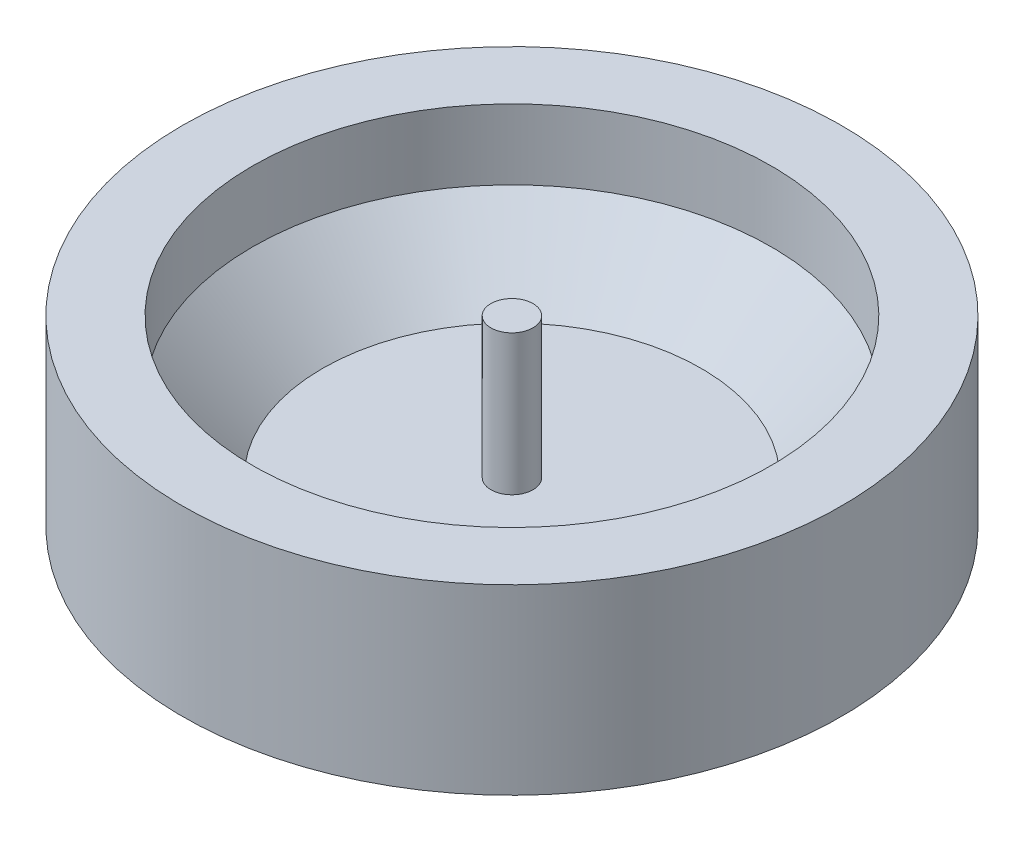
ISO-10303-21;
HEADER;
FILE_DESCRIPTION(('STEP AP214'),'2;1');
FILE_NAME('part.step','',(''),(''),'','','');
FILE_SCHEMA(('AUTOMOTIVE_DESIGN { 1 0 10303 214 1 1 1 1 }'));
ENDSEC;
DATA;
#1=APPLICATION_CONTEXT('core data for automotive mechanical design processes');
#2=APPLICATION_PROTOCOL_DEFINITION('international standard','automotive_design',2000,#1);
#3=PRODUCT_CONTEXT('',#1,'mechanical');
#4=PRODUCT('Part','Part','',(#3));
#5=PRODUCT_RELATED_PRODUCT_CATEGORY('part','',(#4));
#6=PRODUCT_DEFINITION_FORMATION('','',#4);
#7=PRODUCT_DEFINITION_CONTEXT('part definition',#1,'design');
#8=PRODUCT_DEFINITION('design','',#6,#7);
#9=PRODUCT_DEFINITION_SHAPE('','',#8);
#10=(LENGTH_UNIT() NAMED_UNIT(*) SI_UNIT(.MILLI.,.METRE.));
#11=(NAMED_UNIT(*) PLANE_ANGLE_UNIT() SI_UNIT($,.RADIAN.));
#12=(NAMED_UNIT(*) SI_UNIT($,.STERADIAN.) SOLID_ANGLE_UNIT());
#13=UNCERTAINTY_MEASURE_WITH_UNIT(LENGTH_MEASURE(1.E-05),#10,'distance_accuracy_value','');
#14=(GEOMETRIC_REPRESENTATION_CONTEXT(3) GLOBAL_UNCERTAINTY_ASSIGNED_CONTEXT((#13)) GLOBAL_UNIT_ASSIGNED_CONTEXT((#10,
#11,#12)) REPRESENTATION_CONTEXT('',''));
#15=CARTESIAN_POINT('',(0.,0.,0.));
#16=DIRECTION('',(0.,0.,1.));
#17=DIRECTION('',(1.,0.,0.));
#18=AXIS2_PLACEMENT_3D('',#15,#16,#17);
#19=CARTESIAN_POINT('',(-18.5,10.,0.));
#20=DIRECTION('',(0.,1.,0.));
#21=DIRECTION('',(-1.,0.,0.));
#22=AXIS2_PLACEMENT_3D('',#19,#20,#21);
#23=PLANE('',#22);
#24=CARTESIAN_POINT('',(0.,10.,0.));
#25=DIRECTION('',(0.,1.,0.));
#26=DIRECTION('',(-1.,0.,0.));
#27=AXIS2_PLACEMENT_3D('',#24,#25,#26);
#28=CIRCLE('',#27,23.5);
#29=CARTESIAN_POINT('',(-23.5,10.,0.));
#30=VERTEX_POINT('',#29);
#31=EDGE_CURVE('E10',#30,#30,#28,.T.);
#32=ORIENTED_EDGE('',*,*,#31,.T.);
#33=EDGE_LOOP('',(#32));
#34=FACE_BOUND('',#33,.T.);
#35=CARTESIAN_POINT('',(0.,10.,0.));
#36=DIRECTION('',(0.,1.,0.));
#37=DIRECTION('',(-1.,0.,0.));
#38=AXIS2_PLACEMENT_3D('',#35,#36,#37);
#39=CIRCLE('',#38,18.5);
#40=CARTESIAN_POINT('',(-18.5,10.,0.));
#41=VERTEX_POINT('',#40);
#42=EDGE_CURVE('E60',#41,#41,#39,.T.);
#43=ORIENTED_EDGE('',*,*,#42,.F.);
#44=EDGE_LOOP('',(#43));
#45=FACE_BOUND('',#44,.T.);
#46=ADVANCED_FACE('F35',(#34,#45),#23,.T.);
#47=CARTESIAN_POINT('',(0.,9.99999999999999,0.));
#48=DIRECTION('',(0.,1.,0.));
#49=DIRECTION('',(-1.,0.,0.));
#50=AXIS2_PLACEMENT_3D('',#47,#48,#49);
#51=CYLINDRICAL_SURFACE('',#50,23.5);
#52=CARTESIAN_POINT('',(0.,-3.,0.));
#53=DIRECTION('',(0.,1.,0.));
#54=DIRECTION('',(-1.,0.,0.));
#55=AXIS2_PLACEMENT_3D('',#52,#53,#54);
#56=CIRCLE('',#55,23.5);
#57=CARTESIAN_POINT('',(-23.5,-3.,0.));
#58=VERTEX_POINT('',#57);
#59=EDGE_CURVE('E41',#58,#58,#56,.T.);
#60=ORIENTED_EDGE('',*,*,#59,.T.);
#61=EDGE_LOOP('',(#60));
#62=FACE_BOUND('',#61,.T.);
#63=ORIENTED_EDGE('',*,*,#31,.F.);
#64=EDGE_LOOP('',(#63));
#65=FACE_BOUND('',#64,.T.);
#66=ADVANCED_FACE('F68',(#62,#65),#51,.T.);
#67=CARTESIAN_POINT('',(-23.5,-3.,0.));
#68=DIRECTION('',(0.,-1.,0.));
#69=DIRECTION('',(1.,0.,0.));
#70=AXIS2_PLACEMENT_3D('',#67,#68,#69);
#71=PLANE('',#70);
#72=ORIENTED_EDGE('',*,*,#59,.F.);
#73=EDGE_LOOP('',(#72));
#74=FACE_BOUND('',#73,.T.);
#75=ADVANCED_FACE('F72',(#74),#71,.T.);
#76=CARTESIAN_POINT('',(0.,10.,0.));
#77=DIRECTION('',(0.,1.,0.));
#78=DIRECTION('',(-1.,0.,0.));
#79=AXIS2_PLACEMENT_3D('',#76,#77,#78);
#80=PLANE('',#79);
#81=CARTESIAN_POINT('',(0.,10.,0.));
#82=DIRECTION('',(0.,1.,0.));
#83=DIRECTION('',(-1.,0.,0.));
#84=AXIS2_PLACEMENT_3D('',#81,#82,#83);
#85=CIRCLE('',#84,1.5);
#86=CARTESIAN_POINT('',(-1.5,10.,0.));
#87=VERTEX_POINT('',#86);
#88=EDGE_CURVE('E45',#87,#87,#85,.T.);
#89=ORIENTED_EDGE('',*,*,#88,.T.);
#90=EDGE_LOOP('',(#89));
#91=FACE_BOUND('',#90,.T.);
#92=ADVANCED_FACE('F76',(#91),#80,.T.);
#93=CARTESIAN_POINT('',(0.,9.99999999999999,0.));
#94=DIRECTION('',(0.,1.,0.));
#95=DIRECTION('',(-1.,0.,0.));
#96=AXIS2_PLACEMENT_3D('',#93,#94,#95);
#97=CYLINDRICAL_SURFACE('',#96,1.5);
#98=CARTESIAN_POINT('',(0.,0.,0.));
#99=DIRECTION('',(0.,1.,0.));
#100=DIRECTION('',(-1.,0.,0.));
#101=AXIS2_PLACEMENT_3D('',#98,#99,#100);
#102=CIRCLE('',#101,1.5);
#103=CARTESIAN_POINT('',(-1.5,0.,0.));
#104=VERTEX_POINT('',#103);
#105=EDGE_CURVE('E49',#104,#104,#102,.T.);
#106=ORIENTED_EDGE('',*,*,#105,.T.);
#107=EDGE_LOOP('',(#106));
#108=FACE_BOUND('',#107,.T.);
#109=ORIENTED_EDGE('',*,*,#88,.F.);
#110=EDGE_LOOP('',(#109));
#111=FACE_BOUND('',#110,.T.);
#112=ADVANCED_FACE('F83',(#108,#111),#97,.T.);
#113=CARTESIAN_POINT('',(-1.5,0.,0.));
#114=DIRECTION('',(0.,1.,0.));
#115=DIRECTION('',(-1.,0.,0.));
#116=AXIS2_PLACEMENT_3D('',#113,#114,#115);
#117=PLANE('',#116);
#118=CARTESIAN_POINT('',(0.,0.,0.));
#119=DIRECTION('',(0.,1.,0.));
#120=DIRECTION('',(-1.,0.,0.));
#121=AXIS2_PLACEMENT_3D('',#118,#119,#120);
#122=CIRCLE('',#121,13.5);
#123=CARTESIAN_POINT('',(-13.5,0.,0.));
#124=VERTEX_POINT('',#123);
#125=EDGE_CURVE('E54',#124,#124,#122,.T.);
#126=ORIENTED_EDGE('',*,*,#125,.T.);
#127=EDGE_LOOP('',(#126));
#128=FACE_BOUND('',#127,.T.);
#129=ORIENTED_EDGE('',*,*,#105,.F.);
#130=EDGE_LOOP('',(#129));
#131=FACE_BOUND('',#130,.T.);
#132=ADVANCED_FACE('F87',(#128,#131),#117,.T.);
#133=CARTESIAN_POINT('',(0.,0.,0.));
#134=DIRECTION('',(0.,1.,0.));
#135=DIRECTION('',(-1.,0.,0.));
#136=AXIS2_PLACEMENT_3D('',#133,#134,#135);
#137=CONICAL_SURFACE('',#136,13.5,0.785398163397449);
#138=CARTESIAN_POINT('',(0.,5.,0.));
#139=DIRECTION('',(0.,1.,0.));
#140=DIRECTION('',(-1.,0.,0.));
#141=AXIS2_PLACEMENT_3D('',#138,#139,#140);
#142=CIRCLE('',#141,18.5);
#143=CARTESIAN_POINT('',(-18.5,5.,0.));
#144=VERTEX_POINT('',#143);
#145=EDGE_CURVE('E57',#144,#144,#142,.T.);
#146=ORIENTED_EDGE('',*,*,#145,.T.);
#147=EDGE_LOOP('',(#146));
#148=FACE_BOUND('',#147,.T.);
#149=ORIENTED_EDGE('',*,*,#125,.F.);
#150=EDGE_LOOP('',(#149));
#151=FACE_BOUND('',#150,.T.);
#152=ADVANCED_FACE('F91',(#148,#151),#137,.F.);
#153=CARTESIAN_POINT('',(0.,9.99999999999999,0.));
#154=DIRECTION('',(0.,1.,0.));
#155=DIRECTION('',(-1.,0.,0.));
#156=AXIS2_PLACEMENT_3D('',#153,#154,#155);
#157=CYLINDRICAL_SURFACE('',#156,18.5);
#158=ORIENTED_EDGE('',*,*,#42,.T.);
#159=EDGE_LOOP('',(#158));
#160=FACE_BOUND('',#159,.T.);
#161=ORIENTED_EDGE('',*,*,#145,.F.);
#162=EDGE_LOOP('',(#161));
#163=FACE_BOUND('',#162,.T.);
#164=ADVANCED_FACE('F64',(#160,#163),#157,.F.);
#165=CLOSED_SHELL('',(#46,#66,#75,#92,#112,#132,#152,#164));
#166=MANIFOLD_SOLID_BREP('B2',#165);
#167=ADVANCED_BREP_SHAPE_REPRESENTATION('',(#18,#166),#14);
#168=SHAPE_DEFINITION_REPRESENTATION(#9,#167);
ENDSEC;
END-ISO-10303-21;
